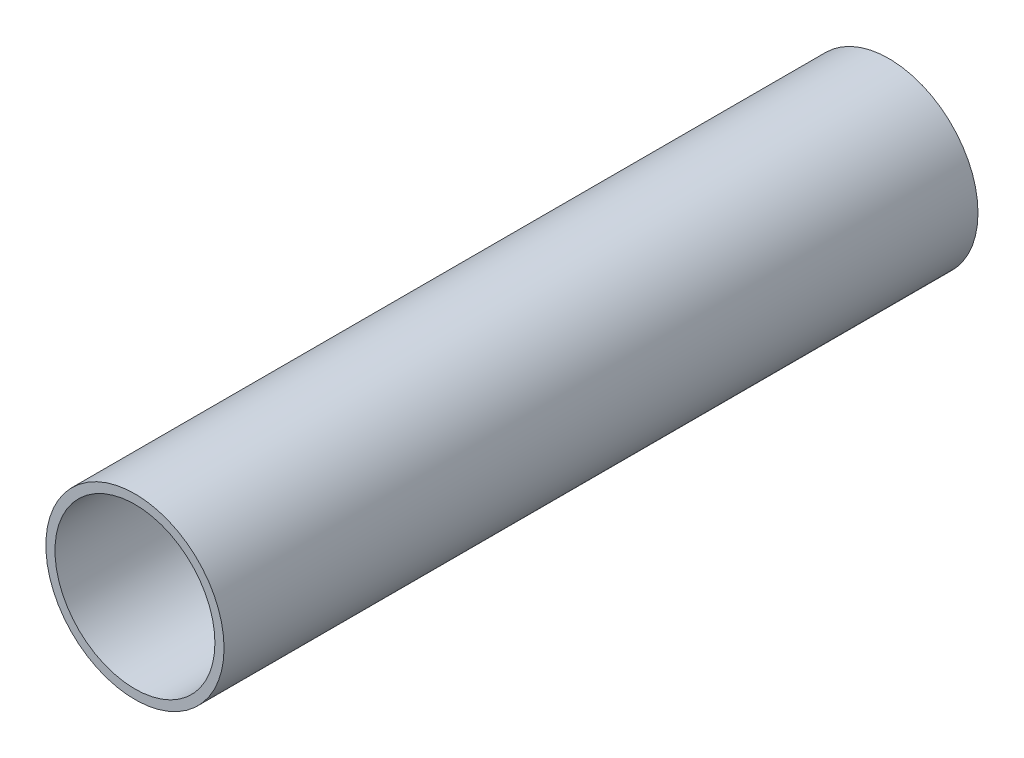
ISO-10303-21;
HEADER;
FILE_DESCRIPTION(('STEP AP214'),'2;1');
FILE_NAME('part.step','',(''),(''),'','','');
FILE_SCHEMA(('AUTOMOTIVE_DESIGN { 1 0 10303 214 1 1 1 1 }'));
ENDSEC;
DATA;
#1=APPLICATION_CONTEXT('core data for automotive mechanical design processes');
#2=APPLICATION_PROTOCOL_DEFINITION('international standard','automotive_design',2000,#1);
#3=PRODUCT_CONTEXT('',#1,'mechanical');
#4=PRODUCT('Part','Part','',(#3));
#5=PRODUCT_RELATED_PRODUCT_CATEGORY('part','',(#4));
#6=PRODUCT_DEFINITION_FORMATION('','',#4);
#7=PRODUCT_DEFINITION_CONTEXT('part definition',#1,'design');
#8=PRODUCT_DEFINITION('design','',#6,#7);
#9=PRODUCT_DEFINITION_SHAPE('','',#8);
#10=(LENGTH_UNIT() NAMED_UNIT(*) SI_UNIT(.MILLI.,.METRE.));
#11=(NAMED_UNIT(*) PLANE_ANGLE_UNIT() SI_UNIT($,.RADIAN.));
#12=(NAMED_UNIT(*) SI_UNIT($,.STERADIAN.) SOLID_ANGLE_UNIT());
#13=UNCERTAINTY_MEASURE_WITH_UNIT(LENGTH_MEASURE(1.E-05),#10,'distance_accuracy_value','');
#14=(GEOMETRIC_REPRESENTATION_CONTEXT(3) GLOBAL_UNCERTAINTY_ASSIGNED_CONTEXT((#13)) GLOBAL_UNIT_ASSIGNED_CONTEXT((#10,
#11,#12)) REPRESENTATION_CONTEXT('',''));
#15=CARTESIAN_POINT('',(0.,0.,0.));
#16=DIRECTION('',(0.,0.,1.));
#17=DIRECTION('',(1.,0.,0.));
#18=AXIS2_PLACEMENT_3D('',#15,#16,#17);
#19=CARTESIAN_POINT('',(0.,0.,16.5));
#20=DIRECTION('',(0.,0.,1.));
#21=DIRECTION('',(1.,0.,0.));
#22=AXIS2_PLACEMENT_3D('',#19,#20,#21);
#23=PLANE('',#22);
#24=CARTESIAN_POINT('',(0.,0.,16.5));
#25=DIRECTION('',(0.,0.,1.));
#26=DIRECTION('',(1.,0.,0.));
#27=AXIS2_PLACEMENT_3D('',#24,#25,#26);
#28=CIRCLE('',#27,1.95);
#29=CARTESIAN_POINT('',(1.95,0.,16.5));
#30=VERTEX_POINT('',#29);
#31=EDGE_CURVE('E10',#30,#30,#28,.T.);
#32=ORIENTED_EDGE('',*,*,#31,.T.);
#33=EDGE_LOOP('',(#32));
#34=FACE_BOUND('',#33,.T.);
#35=CARTESIAN_POINT('',(0.,0.,16.5));
#36=DIRECTION('',(0.,0.,1.));
#37=DIRECTION('',(1.,0.,0.));
#38=AXIS2_PLACEMENT_3D('',#35,#36,#37);
#39=CIRCLE('',#38,1.75);
#40=CARTESIAN_POINT('',(1.75,0.,16.5));
#41=VERTEX_POINT('',#40);
#42=EDGE_CURVE('E45',#41,#41,#39,.T.);
#43=ORIENTED_EDGE('',*,*,#42,.F.);
#44=EDGE_LOOP('',(#43));
#45=FACE_BOUND('',#44,.T.);
#46=ADVANCED_FACE('F34',(#34,#45),#23,.T.);
#47=CARTESIAN_POINT('',(0.,0.,0.));
#48=DIRECTION('',(0.,0.,1.));
#49=DIRECTION('',(1.,0.,0.));
#50=AXIS2_PLACEMENT_3D('',#47,#48,#49);
#51=PLANE('',#50);
#52=CARTESIAN_POINT('',(0.,0.,0.));
#53=DIRECTION('',(0.,0.,1.));
#54=DIRECTION('',(1.,0.,0.));
#55=AXIS2_PLACEMENT_3D('',#52,#53,#54);
#56=CIRCLE('',#55,1.95);
#57=CARTESIAN_POINT('',(1.95,0.,0.));
#58=VERTEX_POINT('',#57);
#59=EDGE_CURVE('E38',#58,#58,#56,.T.);
#60=ORIENTED_EDGE('',*,*,#59,.F.);
#61=EDGE_LOOP('',(#60));
#62=FACE_BOUND('',#61,.T.);
#63=CARTESIAN_POINT('',(0.,0.,0.));
#64=DIRECTION('',(0.,0.,1.));
#65=DIRECTION('',(1.,0.,0.));
#66=AXIS2_PLACEMENT_3D('',#63,#64,#65);
#67=CIRCLE('',#66,1.75);
#68=CARTESIAN_POINT('',(1.75,0.,0.));
#69=VERTEX_POINT('',#68);
#70=EDGE_CURVE('E47',#69,#69,#67,.T.);
#71=ORIENTED_EDGE('',*,*,#70,.T.);
#72=EDGE_LOOP('',(#71));
#73=FACE_BOUND('',#72,.T.);
#74=ADVANCED_FACE('F57',(#62,#73),#51,.F.);
#75=CARTESIAN_POINT('',(0.,0.,16.5));
#76=DIRECTION('',(0.,0.,-1.));
#77=DIRECTION('',(-1.,0.,0.));
#78=AXIS2_PLACEMENT_3D('',#75,#76,#77);
#79=CYLINDRICAL_SURFACE('',#78,1.95);
#80=ORIENTED_EDGE('',*,*,#31,.F.);
#81=EDGE_LOOP('',(#80));
#82=FACE_BOUND('',#81,.T.);
#83=ORIENTED_EDGE('',*,*,#59,.T.);
#84=EDGE_LOOP('',(#83));
#85=FACE_BOUND('',#84,.T.);
#86=ADVANCED_FACE('F36',(#82,#85),#79,.T.);
#87=CARTESIAN_POINT('',(0.,0.,16.5));
#88=DIRECTION('',(0.,0.,-1.));
#89=DIRECTION('',(-1.,0.,0.));
#90=AXIS2_PLACEMENT_3D('',#87,#88,#89);
#91=CYLINDRICAL_SURFACE('',#90,1.75);
#92=ORIENTED_EDGE('',*,*,#42,.T.);
#93=EDGE_LOOP('',(#92));
#94=FACE_BOUND('',#93,.T.);
#95=ORIENTED_EDGE('',*,*,#70,.F.);
#96=EDGE_LOOP('',(#95));
#97=FACE_BOUND('',#96,.T.);
#98=ADVANCED_FACE('F53',(#94,#97),#91,.F.);
#99=CLOSED_SHELL('',(#46,#74,#86,#98));
#100=MANIFOLD_SOLID_BREP('B2',#99);
#101=ADVANCED_BREP_SHAPE_REPRESENTATION('',(#18,#100),#14);
#102=SHAPE_DEFINITION_REPRESENTATION(#9,#101);
ENDSEC;
END-ISO-10303-21;
